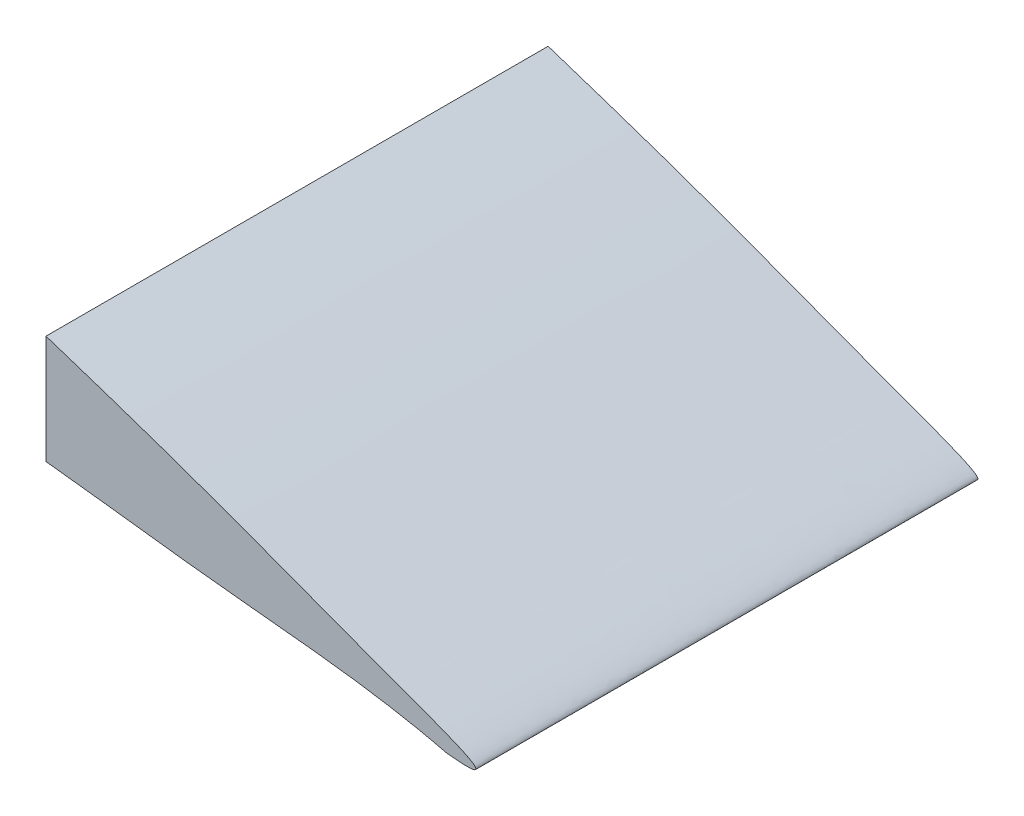
ISO-10303-21;
HEADER;
FILE_DESCRIPTION(('STEP AP214'),'2;1');
FILE_NAME('part.step','',(''),(''),'','','');
FILE_SCHEMA(('AUTOMOTIVE_DESIGN { 1 0 10303 214 1 1 1 1 }'));
ENDSEC;
DATA;
#1=APPLICATION_CONTEXT('core data for automotive mechanical design processes');
#2=APPLICATION_PROTOCOL_DEFINITION('international standard','automotive_design',2000,#1);
#3=PRODUCT_CONTEXT('',#1,'mechanical');
#4=PRODUCT('Part','Part','',(#3));
#5=PRODUCT_RELATED_PRODUCT_CATEGORY('part','',(#4));
#6=PRODUCT_DEFINITION_FORMATION('','',#4);
#7=PRODUCT_DEFINITION_CONTEXT('part definition',#1,'design');
#8=PRODUCT_DEFINITION('design','',#6,#7);
#9=PRODUCT_DEFINITION_SHAPE('','',#8);
#10=(LENGTH_UNIT() NAMED_UNIT(*) SI_UNIT(.MILLI.,.METRE.));
#11=(NAMED_UNIT(*) PLANE_ANGLE_UNIT() SI_UNIT($,.RADIAN.));
#12=(NAMED_UNIT(*) SI_UNIT($,.STERADIAN.) SOLID_ANGLE_UNIT());
#13=UNCERTAINTY_MEASURE_WITH_UNIT(LENGTH_MEASURE(1.E-05),#10,'distance_accuracy_value','');
#14=(GEOMETRIC_REPRESENTATION_CONTEXT(3) GLOBAL_UNCERTAINTY_ASSIGNED_CONTEXT((#13)) GLOBAL_UNIT_ASSIGNED_CONTEXT((#10,
#11,#12)) REPRESENTATION_CONTEXT('',''));
#15=CARTESIAN_POINT('',(0.,0.,0.));
#16=DIRECTION('',(0.,0.,1.));
#17=DIRECTION('',(1.,0.,0.));
#18=AXIS2_PLACEMENT_3D('',#15,#16,#17);
#19=CARTESIAN_POINT('',(0.000560351162113587,0.000130087070423624,38.1));
#20=CARTESIAN_POINT('',(1.23071418869678,-6.92407609127206,38.1));
#21=CARTESIAN_POINT('',(15.3166033306834,-6.18906584099094,38.1));
#22=CARTESIAN_POINT('',(36.4546728163185,-6.09849990105009,38.1));
#23=CARTESIAN_POINT('',(66.5061971849192,-0.586669106973501,38.1));
#24=CARTESIAN_POINT('',(110.497331171581,6.18149522271792,38.1));
#25=CARTESIAN_POINT('',(157.718638091679,9.03065014873911,38.1));
#26=CARTESIAN_POINT('',(205.10142463584,8.83808028186313,38.1));
#27=CARTESIAN_POINT('',(235.858814759408,7.87030619247826,38.1));
#28=CARTESIAN_POINT('',(260.846344817159,5.42741339404395,38.1));
#29=CARTESIAN_POINT('',(276.264022989737,4.51435670375389,38.1));
#30=CARTESIAN_POINT('',(293.989507544058,2.09398731346533,38.1));
#31=CARTESIAN_POINT('',(303.956832564589,1.47095520994628,38.1));
#32=CARTESIAN_POINT('',(309.846313894505,0.000130087070423666,38.1));
#33=B_SPLINE_CURVE_WITH_KNOTS('',3,(#19,#20,#21,#22,#23,#24,#25,#26,#27,#28,#29,#30,#31,#32),
.UNSPECIFIED.,.F.,.F.,(4,1,1,1,1,1,1,1,1,1,1,4),(0.,0.0569078595717698,0.106482711504673,
0.214488052979465,0.341297688349143,0.535095665520157,0.664680853556909,0.794660698192775,
0.828978881532905,0.904725108725214,0.942212919019968,1.),.UNSPECIFIED.);
#34=DIRECTION('',(0.,0.,-1.));
#35=VECTOR('',#34,1.);
#36=SURFACE_OF_LINEAR_EXTRUSION('',#33,#35);
#37=CARTESIAN_POINT('',(279.400560351162,3.963287461144,38.1));
#38=VERTEX_POINT('',#37);
#39=CARTESIAN_POINT('',(309.846313894505,0.000130087070423864,38.1));
#40=VERTEX_POINT('',#39);
#41=EDGE_CURVE('E64',#38,#40,#33,.T.);
#42=ORIENTED_EDGE('',*,*,#41,.F.);
#43=DIRECTION('',(0.,0.,-1.));
#44=VECTOR('',#43,1.);
#45=CARTESIAN_POINT('',(279.400560351162,3.96328746010701,38.1));
#46=LINE('',#45,#44);
#47=CARTESIAN_POINT('',(279.400560351162,3.963287461144,0.));
#48=VERTEX_POINT('',#47);
#49=EDGE_CURVE('E75',#38,#48,#46,.T.);
#50=ORIENTED_EDGE('',*,*,#49,.T.);
#51=CARTESIAN_POINT('',(0.000560351162113587,0.000130087070423624,0.));
#52=CARTESIAN_POINT('',(1.23071418869678,-6.92407609127206,0.));
#53=CARTESIAN_POINT('',(15.3166033306834,-6.18906584099094,0.));
#54=CARTESIAN_POINT('',(36.4546728163185,-6.09849990105009,0.));
#55=CARTESIAN_POINT('',(66.5061971849192,-0.586669106973501,0.));
#56=CARTESIAN_POINT('',(110.497331171581,6.18149522271792,0.));
#57=CARTESIAN_POINT('',(157.718638091679,9.03065014873911,0.));
#58=CARTESIAN_POINT('',(205.10142463584,8.83808028186313,0.));
#59=CARTESIAN_POINT('',(235.858814759408,7.87030619247826,0.));
#60=CARTESIAN_POINT('',(260.846344817159,5.42741339404395,0.));
#61=CARTESIAN_POINT('',(276.264022989737,4.51435670375389,0.));
#62=CARTESIAN_POINT('',(293.989507544058,2.09398731346533,0.));
#63=CARTESIAN_POINT('',(303.956832564589,1.47095520994628,0.));
#64=CARTESIAN_POINT('',(309.846313894505,0.000130087070423666,0.));
#65=B_SPLINE_CURVE_WITH_KNOTS('',3,(#51,#52,#53,#54,#55,#56,#57,#58,#59,#60,#61,#62,#63,#64),
.UNSPECIFIED.,.F.,.F.,(4,1,1,1,1,1,1,1,1,1,1,4),(0.,0.0569078595717698,0.106482711504673,
0.214488052979465,0.341297688349143,0.535095665520157,0.664680853556909,0.794660698192775,
0.828978881532905,0.904725108725214,0.942212919019968,1.),.UNSPECIFIED.);
#66=CARTESIAN_POINT('',(309.846313894505,0.000130087070423864,0.));
#67=VERTEX_POINT('',#66);
#68=EDGE_CURVE('E82',#48,#67,#65,.T.);
#69=ORIENTED_EDGE('',*,*,#68,.T.);
#70=DIRECTION('',(0.,0.,-1.));
#71=VECTOR('',#70,1.);
#72=CARTESIAN_POINT('',(309.846313894505,0.000130087070423864,38.1));
#73=LINE('',#72,#71);
#74=EDGE_CURVE('E11',#40,#67,#73,.T.);
#75=ORIENTED_EDGE('',*,*,#74,.F.);
#76=EDGE_LOOP('',(#42,#50,#69,#75));
#77=FACE_BOUND('',#76,.T.);
#78=ADVANCED_FACE('F39',(#77),#36,.F.);
#79=CARTESIAN_POINT('',(309.846313894505,0.000130087070423864,38.1));
#80=CARTESIAN_POINT('',(314.816918223261,-0.51620674157964,38.1));
#81=CARTESIAN_POINT('',(301.273197720551,4.38282813873556,38.1));
#82=CARTESIAN_POINT('',(290.359837670022,8.71099439045776,38.1));
#83=CARTESIAN_POINT('',(256.952064400645,19.5289209482833,38.1));
#84=CARTESIAN_POINT('',(217.961060472083,29.6129748944238,38.1));
#85=CARTESIAN_POINT('',(173.256699242147,40.0411042779434,38.1));
#86=CARTESIAN_POINT('',(131.400792108858,47.8848319151037,38.1));
#87=CARTESIAN_POINT('',(89.5976184754884,49.290763053775,38.1));
#88=CARTESIAN_POINT('',(52.1111282710831,42.0692152748914,38.1));
#89=CARTESIAN_POINT('',(26.2867198183782,29.9751763284633,38.1));
#90=CARTESIAN_POINT('',(8.64909202481883,17.8566051741579,38.1));
#91=CARTESIAN_POINT('',(0.810633126632263,7.35919605469637,38.1));
#92=CARTESIAN_POINT('',(0.000560351162116727,0.000130087070423829,38.1));
#93=B_SPLINE_CURVE_WITH_KNOTS('',3,(#79,#80,#81,#82,#83,#84,#85,#86,#87,#88,#89,#90,#91,#92),
.UNSPECIFIED.,.F.,.F.,(4,1,1,1,1,1,1,1,1,1,1,4),(0.,0.0239417713693992,0.070244030177139,
0.147561721425381,0.308455887006792,0.442387865106874,0.551517565626309,0.687091076796298,
0.811391258419108,0.886311735305172,0.939136382225768,1.),.UNSPECIFIED.);
#94=DIRECTION('',(0.,0.,-1.));
#95=VECTOR('',#94,1.);
#96=SURFACE_OF_LINEAR_EXTRUSION('',#93,#95);
#97=CARTESIAN_POINT('',(309.846313894505,0.000130087070423864,0.));
#98=CARTESIAN_POINT('',(314.816918223261,-0.51620674157964,0.));
#99=CARTESIAN_POINT('',(301.273197720551,4.38282813873556,0.));
#100=CARTESIAN_POINT('',(290.359837670022,8.71099439045776,0.));
#101=CARTESIAN_POINT('',(256.952064400645,19.5289209482833,0.));
#102=CARTESIAN_POINT('',(217.961060472083,29.6129748944238,0.));
#103=CARTESIAN_POINT('',(173.256699242147,40.0411042779434,0.));
#104=CARTESIAN_POINT('',(131.400792108858,47.8848319151037,0.));
#105=CARTESIAN_POINT('',(89.5976184754884,49.290763053775,0.));
#106=CARTESIAN_POINT('',(52.1111282710831,42.0692152748914,0.));
#107=CARTESIAN_POINT('',(26.2867198183782,29.9751763284633,0.));
#108=CARTESIAN_POINT('',(8.64909202481883,17.8566051741579,0.));
#109=CARTESIAN_POINT('',(0.810633126632263,7.35919605469637,0.));
#110=CARTESIAN_POINT('',(0.000560351162116727,0.000130087070423829,0.));
#111=B_SPLINE_CURVE_WITH_KNOTS('',3,(#97,#98,#99,#100,#101,#102,#103,#104,#105,#106,#107,#108,
#109,#110),.UNSPECIFIED.,.F.,.F.,(4,1,1,1,1,1,1,1,1,1,1,4),(0.,0.0239417713693992,
0.070244030177139,0.147561721425381,0.308455887006792,0.442387865106874,0.551517565626309,
0.687091076796298,0.811391258419108,0.886311735305172,0.939136382225768,1.),.UNSPECIFIED.);
#112=CARTESIAN_POINT('',(279.40056035979,12.2072210123206,0.));
#113=VERTEX_POINT('',#112);
#114=EDGE_CURVE('E89',#67,#113,#111,.T.);
#115=ORIENTED_EDGE('',*,*,#114,.T.);
#116=DIRECTION('',(0.,0.,-1.));
#117=VECTOR('',#116,1.);
#118=CARTESIAN_POINT('',(279.400560351162,12.207221015124,38.1));
#119=LINE('',#118,#117);
#120=CARTESIAN_POINT('',(279.400560351162,12.2072210123206,38.1));
#121=VERTEX_POINT('',#120);
#122=EDGE_CURVE('E55',#113,#121,#119,.F.);
#123=ORIENTED_EDGE('',*,*,#122,.T.);
#124=EDGE_CURVE('E48',#40,#121,#93,.T.);
#125=ORIENTED_EDGE('',*,*,#124,.F.);
#126=ORIENTED_EDGE('',*,*,#74,.T.);
#127=EDGE_LOOP('',(#115,#123,#125,#126));
#128=FACE_BOUND('',#127,.T.);
#129=ADVANCED_FACE('F110',(#128),#96,.F.);
#130=CARTESIAN_POINT('',(153.387816973495,8.33338198857885,38.1));
#131=DIRECTION('',(0.,0.,-1.));
#132=DIRECTION('',(-1.,0.,0.));
#133=AXIS2_PLACEMENT_3D('',#130,#131,#132);
#134=PLANE('',#133);
#135=ORIENTED_EDGE('',*,*,#124,.T.);
#136=DIRECTION('',(0.,1.,0.));
#137=VECTOR('',#136,1.);
#138=CARTESIAN_POINT('',(279.400560351162,-24.2165503945353,38.1));
#139=LINE('',#138,#137);
#140=EDGE_CURVE('E77',#38,#121,#139,.T.);
#141=ORIENTED_EDGE('',*,*,#140,.F.);
#142=ORIENTED_EDGE('',*,*,#41,.T.);
#143=EDGE_LOOP('',(#135,#141,#142));
#144=FACE_BOUND('',#143,.T.);
#145=ADVANCED_FACE('F84',(#144),#134,.F.);
#146=CARTESIAN_POINT('',(153.387816973495,8.33338198857885,0.));
#147=DIRECTION('',(0.,0.,-1.));
#148=DIRECTION('',(-1.,0.,0.));
#149=AXIS2_PLACEMENT_3D('',#146,#147,#148);
#150=PLANE('',#149);
#151=DIRECTION('',(0.,1.,0.));
#152=VECTOR('',#151,1.);
#153=CARTESIAN_POINT('',(279.400560351162,-24.2165503945353,0.));
#154=LINE('',#153,#152);
#155=EDGE_CURVE('E78',#48,#113,#154,.T.);
#156=ORIENTED_EDGE('',*,*,#155,.T.);
#157=ORIENTED_EDGE('',*,*,#114,.F.);
#158=ORIENTED_EDGE('',*,*,#68,.F.);
#159=EDGE_LOOP('',(#156,#157,#158));
#160=FACE_BOUND('',#159,.T.);
#161=ADVANCED_FACE('F114',(#160),#150,.T.);
#162=CARTESIAN_POINT('',(279.400560351162,-24.2165503945353,0.));
#163=DIRECTION('',(1.,0.,0.));
#164=DIRECTION('',(0.,0.,-1.));
#165=AXIS2_PLACEMENT_3D('',#162,#163,#164);
#166=PLANE('',#165);
#167=ORIENTED_EDGE('',*,*,#140,.T.);
#168=ORIENTED_EDGE('',*,*,#122,.F.);
#169=ORIENTED_EDGE('',*,*,#155,.F.);
#170=ORIENTED_EDGE('',*,*,#49,.F.);
#171=EDGE_LOOP('',(#167,#168,#169,#170));
#172=FACE_BOUND('',#171,.T.);
#173=ADVANCED_FACE('F76',(#172),#166,.F.);
#174=CLOSED_SHELL('',(#78,#129,#145,#161,#173));
#175=MANIFOLD_SOLID_BREP('B2',#174);
#176=ADVANCED_BREP_SHAPE_REPRESENTATION('',(#18,#175),#14);
#177=SHAPE_DEFINITION_REPRESENTATION(#9,#176);
ENDSEC;
END-ISO-10303-21;
